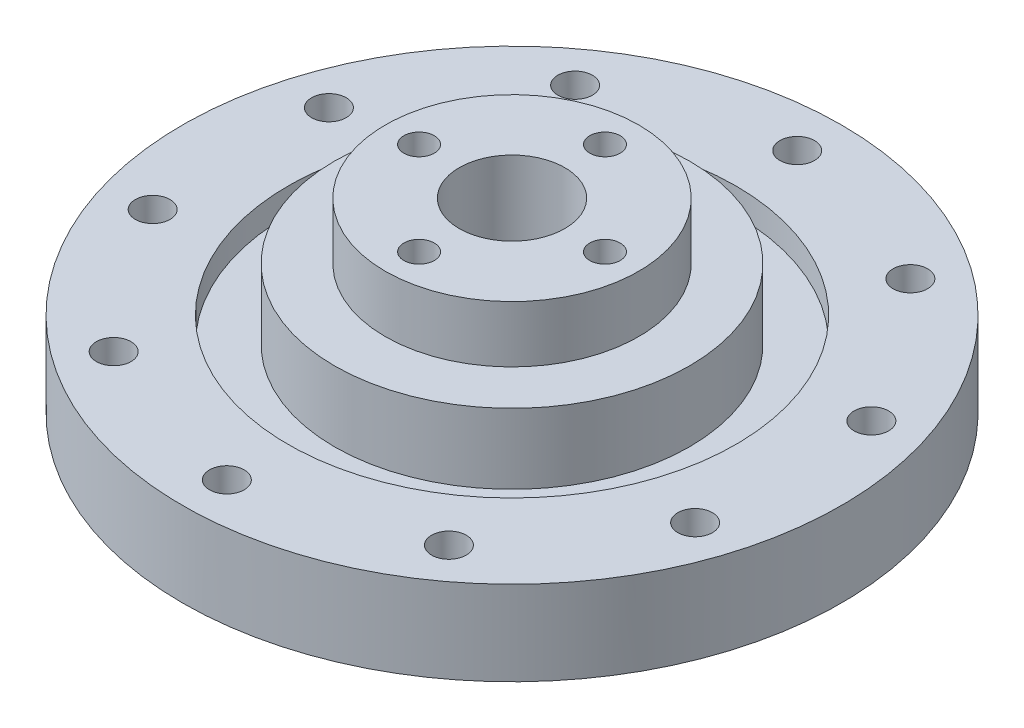
ISO-10303-21;
HEADER;
FILE_DESCRIPTION(('STEP AP214'),'2;1');
FILE_NAME('part.step','',(''),(''),'','','');
FILE_SCHEMA(('AUTOMOTIVE_DESIGN { 1 0 10303 214 1 1 1 1 }'));
ENDSEC;
DATA;
#1=APPLICATION_CONTEXT('core data for automotive mechanical design processes');
#2=APPLICATION_PROTOCOL_DEFINITION('international standard','automotive_design',2000,#1);
#3=PRODUCT_CONTEXT('',#1,'mechanical');
#4=PRODUCT('Part','Part','',(#3));
#5=PRODUCT_RELATED_PRODUCT_CATEGORY('part','',(#4));
#6=PRODUCT_DEFINITION_FORMATION('','',#4);
#7=PRODUCT_DEFINITION_CONTEXT('part definition',#1,'design');
#8=PRODUCT_DEFINITION('design','',#6,#7);
#9=PRODUCT_DEFINITION_SHAPE('','',#8);
#10=(LENGTH_UNIT() NAMED_UNIT(*) SI_UNIT(.MILLI.,.METRE.));
#11=(NAMED_UNIT(*) PLANE_ANGLE_UNIT() SI_UNIT($,.RADIAN.));
#12=(NAMED_UNIT(*) SI_UNIT($,.STERADIAN.) SOLID_ANGLE_UNIT());
#13=UNCERTAINTY_MEASURE_WITH_UNIT(LENGTH_MEASURE(1.E-05),#10,'distance_accuracy_value','');
#14=(GEOMETRIC_REPRESENTATION_CONTEXT(3) GLOBAL_UNCERTAINTY_ASSIGNED_CONTEXT((#13)) GLOBAL_UNIT_ASSIGNED_CONTEXT((#10,
#11,#12)) REPRESENTATION_CONTEXT('',''));
#15=CARTESIAN_POINT('',(0.,0.,0.));
#16=DIRECTION('',(0.,0.,1.));
#17=DIRECTION('',(1.,0.,0.));
#18=AXIS2_PLACEMENT_3D('',#15,#16,#17);
#19=CARTESIAN_POINT('',(0.,0.,0.));
#20=DIRECTION('',(0.,1.,0.));
#21=DIRECTION('',(0.,0.,1.));
#22=AXIS2_PLACEMENT_3D('',#19,#20,#21);
#23=PLANE('',#22);
#24=CARTESIAN_POINT('',(0.,0.,0.));
#25=DIRECTION('',(0.,1.,0.));
#26=DIRECTION('',(0.,0.,1.));
#27=AXIS2_PLACEMENT_3D('',#24,#25,#26);
#28=CIRCLE('',#27,39.);
#29=CARTESIAN_POINT('',(0.,0.,39.));
#30=VERTEX_POINT('',#29);
#31=EDGE_CURVE('E10',#30,#30,#28,.T.);
#32=ORIENTED_EDGE('',*,*,#31,.F.);
#33=EDGE_LOOP('',(#32));
#34=FACE_BOUND('',#33,.T.);
#35=CARTESIAN_POINT('',(19.8377522648712,0.,-27.3043235601553));
#36=DIRECTION('',(0.,1.,0.));
#37=DIRECTION('',(0.,0.,1.));
#38=AXIS2_PLACEMENT_3D('',#35,#36,#37);
#39=CIRCLE('',#38,2.05000000000006);
#40=CARTESIAN_POINT('',(19.8377522648712,0.,-25.2543235601553));
#41=VERTEX_POINT('',#40);
#42=EDGE_CURVE('E138',#41,#41,#39,.T.);
#43=ORIENTED_EDGE('',*,*,#42,.T.);
#44=EDGE_LOOP('',(#43));
#45=FACE_BOUND('',#44,.T.);
#46=CARTESIAN_POINT('',(32.0981574249624,0.,-10.4293235601558));
#47=DIRECTION('',(0.,1.,0.));
#48=DIRECTION('',(0.,0.,1.));
#49=AXIS2_PLACEMENT_3D('',#46,#47,#48);
#50=CIRCLE('',#49,2.05000000000065);
#51=CARTESIAN_POINT('',(32.0981574249624,0.,-8.37932356015519));
#52=VERTEX_POINT('',#51);
#53=EDGE_CURVE('E142',#52,#52,#50,.T.);
#54=ORIENTED_EDGE('',*,*,#53,.T.);
#55=EDGE_LOOP('',(#54));
#56=FACE_BOUND('',#55,.T.);
#57=CARTESIAN_POINT('',(32.0981574249633,0.,10.4293235601531));
#58=DIRECTION('',(0.,1.,0.));
#59=DIRECTION('',(0.,0.,1.));
#60=AXIS2_PLACEMENT_3D('',#57,#58,#59);
#61=CIRCLE('',#60,2.05000000000154);
#62=CARTESIAN_POINT('',(32.0981574249633,0.,12.4793235601547));
#63=VERTEX_POINT('',#62);
#64=EDGE_CURVE('E146',#63,#63,#61,.T.);
#65=ORIENTED_EDGE('',*,*,#64,.T.);
#66=EDGE_LOOP('',(#65));
#67=FACE_BOUND('',#66,.T.);
#68=CARTESIAN_POINT('',(19.8377522648736,0.,27.3043235601536));
#69=DIRECTION('',(0.,1.,0.));
#70=DIRECTION('',(0.,0.,1.));
#71=AXIS2_PLACEMENT_3D('',#68,#69,#70);
#72=CIRCLE('',#71,2.05000000000241);
#73=CARTESIAN_POINT('',(19.8377522648736,0.,29.354323560156));
#74=VERTEX_POINT('',#73);
#75=EDGE_CURVE('E150',#74,#74,#72,.T.);
#76=ORIENTED_EDGE('',*,*,#75,.T.);
#77=EDGE_LOOP('',(#76));
#78=FACE_BOUND('',#77,.T.);
#79=CARTESIAN_POINT('',(2.86529853098704E-12,0.,33.75));
#80=DIRECTION('',(0.,1.,0.));
#81=DIRECTION('',(0.,0.,1.));
#82=AXIS2_PLACEMENT_3D('',#79,#80,#81);
#83=CIRCLE('',#82,2.05000000000297);
#84=CARTESIAN_POINT('',(2.86529853098704E-12,0.,35.800000000003));
#85=VERTEX_POINT('',#84);
#86=EDGE_CURVE('E154',#85,#85,#83,.T.);
#87=ORIENTED_EDGE('',*,*,#86,.T.);
#88=EDGE_LOOP('',(#87));
#89=FACE_BOUND('',#88,.T.);
#90=CARTESIAN_POINT('',(-19.8377522648684,0.,27.3043235601553));
#91=DIRECTION('',(0.,1.,0.));
#92=DIRECTION('',(0.,0.,1.));
#93=AXIS2_PLACEMENT_3D('',#90,#91,#92);
#94=CIRCLE('',#93,2.050000000003);
#95=CARTESIAN_POINT('',(-19.8377522648684,0.,29.3543235601583));
#96=VERTEX_POINT('',#95);
#97=EDGE_CURVE('E158',#96,#96,#94,.T.);
#98=ORIENTED_EDGE('',*,*,#97,.T.);
#99=EDGE_LOOP('',(#98));
#100=FACE_BOUND('',#99,.T.);
#101=CARTESIAN_POINT('',(-32.0981574249596,0.,10.4293235601558));
#102=DIRECTION('',(0.,1.,0.));
#103=DIRECTION('',(0.,0.,1.));
#104=AXIS2_PLACEMENT_3D('',#101,#102,#103);
#105=CIRCLE('',#104,2.0500000000025);
#106=CARTESIAN_POINT('',(-32.0981574249596,0.,12.4793235601583));
#107=VERTEX_POINT('',#106);
#108=EDGE_CURVE('E162',#107,#107,#105,.T.);
#109=ORIENTED_EDGE('',*,*,#108,.T.);
#110=EDGE_LOOP('',(#109));
#111=FACE_BOUND('',#110,.T.);
#112=CARTESIAN_POINT('',(-32.0981574249604,0.,-10.4293235601531));
#113=DIRECTION('',(0.,1.,0.));
#114=DIRECTION('',(0.,0.,1.));
#115=AXIS2_PLACEMENT_3D('',#112,#113,#114);
#116=CIRCLE('',#115,2.05000000000172);
#117=CARTESIAN_POINT('',(-32.0981574249604,0.,-8.37932356015139));
#118=VERTEX_POINT('',#117);
#119=EDGE_CURVE('E166',#118,#118,#116,.T.);
#120=ORIENTED_EDGE('',*,*,#119,.T.);
#121=EDGE_LOOP('',(#120));
#122=FACE_BOUND('',#121,.T.);
#123=CARTESIAN_POINT('',(-19.8377522648707,0.,-27.3043235601536));
#124=DIRECTION('',(0.,1.,0.));
#125=DIRECTION('',(0.,0.,1.));
#126=AXIS2_PLACEMENT_3D('',#123,#124,#125);
#127=CIRCLE('',#126,2.05000000000094);
#128=CARTESIAN_POINT('',(-19.8377522648707,0.,-25.2543235601527));
#129=VERTEX_POINT('',#128);
#130=EDGE_CURVE('E170',#129,#129,#127,.T.);
#131=ORIENTED_EDGE('',*,*,#130,.T.);
#132=EDGE_LOOP('',(#131));
#133=FACE_BOUND('',#132,.T.);
#134=CARTESIAN_POINT('',(0.,0.,-33.75));
#135=DIRECTION('',(0.,1.,0.));
#136=DIRECTION('',(0.,0.,1.));
#137=AXIS2_PLACEMENT_3D('',#134,#135,#136);
#138=CIRCLE('',#137,2.05);
#139=CARTESIAN_POINT('',(0.,0.,-31.7));
#140=VERTEX_POINT('',#139);
#141=EDGE_CURVE('E174',#140,#140,#138,.T.);
#142=ORIENTED_EDGE('',*,*,#141,.T.);
#143=EDGE_LOOP('',(#142));
#144=FACE_BOUND('',#143,.T.);
#145=CARTESIAN_POINT('',(11.,0.,0.));
#146=DIRECTION('',(0.,-1.,0.));
#147=DIRECTION('',(0.,0.,-1.));
#148=AXIS2_PLACEMENT_3D('',#145,#146,#147);
#149=CIRCLE('',#148,4.55);
#150=CARTESIAN_POINT('',(11.,0.,-4.54999999999996));
#151=VERTEX_POINT('',#150);
#152=EDGE_CURVE('E178',#151,#151,#149,.T.);
#153=ORIENTED_EDGE('',*,*,#152,.F.);
#154=EDGE_LOOP('',(#153));
#155=FACE_BOUND('',#154,.T.);
#156=CARTESIAN_POINT('',(0.,0.,-11.));
#157=DIRECTION('',(0.,-1.,0.));
#158=DIRECTION('',(0.,0.,-1.));
#159=AXIS2_PLACEMENT_3D('',#156,#157,#158);
#160=CIRCLE('',#159,4.55);
#161=CARTESIAN_POINT('',(0.,0.,-15.55));
#162=VERTEX_POINT('',#161);
#163=EDGE_CURVE('E84',#162,#162,#160,.T.);
#164=ORIENTED_EDGE('',*,*,#163,.F.);
#165=EDGE_LOOP('',(#164));
#166=FACE_BOUND('',#165,.T.);
#167=CARTESIAN_POINT('',(-10.9999999999998,0.,1.55645846127691E-13));
#168=DIRECTION('',(0.,-1.,0.));
#169=DIRECTION('',(0.,0.,-1.));
#170=AXIS2_PLACEMENT_3D('',#167,#168,#169);
#171=CIRCLE('',#170,4.55);
#172=CARTESIAN_POINT('',(-10.9999999999998,0.,-4.54999999999985));
#173=VERTEX_POINT('',#172);
#174=EDGE_CURVE('E70',#173,#173,#171,.T.);
#175=ORIENTED_EDGE('',*,*,#174,.F.);
#176=EDGE_LOOP('',(#175));
#177=FACE_BOUND('',#176,.T.);
#178=CARTESIAN_POINT('',(0.,0.,0.));
#179=DIRECTION('',(0.,1.,0.));
#180=DIRECTION('',(0.,0.,1.));
#181=AXIS2_PLACEMENT_3D('',#178,#179,#180);
#182=CIRCLE('',#181,6.25);
#183=CARTESIAN_POINT('',(0.,0.,6.25));
#184=VERTEX_POINT('',#183);
#185=EDGE_CURVE('E58',#184,#184,#182,.T.);
#186=ORIENTED_EDGE('',*,*,#185,.T.);
#187=EDGE_LOOP('',(#186));
#188=FACE_BOUND('',#187,.T.);
#189=CARTESIAN_POINT('',(3.08597469297258E-13,0.,11.));
#190=DIRECTION('',(0.,-1.,0.));
#191=DIRECTION('',(0.,0.,-1.));
#192=AXIS2_PLACEMENT_3D('',#189,#190,#191);
#193=CIRCLE('',#192,4.55);
#194=CARTESIAN_POINT('',(3.08597469297258E-13,0.,6.45));
#195=VERTEX_POINT('',#194);
#196=EDGE_CURVE('E66',#195,#195,#193,.T.);
#197=ORIENTED_EDGE('',*,*,#196,.F.);
#198=EDGE_LOOP('',(#197));
#199=FACE_BOUND('',#198,.T.);
#200=ADVANCED_FACE('F43',(#34,#45,#56,#67,#78,#89,#100,#111,#122,#133,#144,#155,#166,#177,#188,
#199),#23,.F.);
#201=CARTESIAN_POINT('',(0.,7.,0.));
#202=DIRECTION('',(0.,-1.,0.));
#203=DIRECTION('',(0.,0.,-1.));
#204=AXIS2_PLACEMENT_3D('',#201,#202,#203);
#205=CYLINDRICAL_SURFACE('',#204,39.);
#206=ORIENTED_EDGE('',*,*,#31,.T.);
#207=EDGE_LOOP('',(#206));
#208=FACE_BOUND('',#207,.T.);
#209=CARTESIAN_POINT('',(0.,10.,0.));
#210=DIRECTION('',(0.,-1.,0.));
#211=DIRECTION('',(0.,0.,-1.));
#212=AXIS2_PLACEMENT_3D('',#209,#210,#211);
#213=CIRCLE('',#212,39.);
#214=CARTESIAN_POINT('',(0.,10.,-39.));
#215=VERTEX_POINT('',#214);
#216=EDGE_CURVE('E252',#215,#215,#213,.T.);
#217=ORIENTED_EDGE('',*,*,#216,.T.);
#218=EDGE_LOOP('',(#217));
#219=FACE_BOUND('',#218,.T.);
#220=ADVANCED_FACE('F45',(#208,#219),#205,.T.);
#221=CARTESIAN_POINT('',(0.,22.,0.));
#222=DIRECTION('',(0.,-1.,0.));
#223=DIRECTION('',(0.,0.,-1.));
#224=AXIS2_PLACEMENT_3D('',#221,#222,#223);
#225=CYLINDRICAL_SURFACE('',#224,15.);
#226=CARTESIAN_POINT('',(0.,15.3,0.));
#227=DIRECTION('',(0.,1.,0.));
#228=DIRECTION('',(0.,0.,1.));
#229=AXIS2_PLACEMENT_3D('',#226,#227,#228);
#230=CIRCLE('',#229,15.);
#231=CARTESIAN_POINT('',(0.,15.3,15.));
#232=VERTEX_POINT('',#231);
#233=EDGE_CURVE('E301',#232,#232,#230,.T.);
#234=ORIENTED_EDGE('',*,*,#233,.T.);
#235=EDGE_LOOP('',(#234));
#236=FACE_BOUND('',#235,.T.);
#237=CARTESIAN_POINT('',(0.,22.,0.));
#238=DIRECTION('',(0.,1.,0.));
#239=DIRECTION('',(0.,0.,1.));
#240=AXIS2_PLACEMENT_3D('',#237,#238,#239);
#241=CIRCLE('',#240,15.);
#242=CARTESIAN_POINT('',(0.,22.,15.));
#243=VERTEX_POINT('',#242);
#244=EDGE_CURVE('E52',#243,#243,#241,.T.);
#245=ORIENTED_EDGE('',*,*,#244,.F.);
#246=EDGE_LOOP('',(#245));
#247=FACE_BOUND('',#246,.T.);
#248=ADVANCED_FACE('F115',(#236,#247),#225,.T.);
#249=CARTESIAN_POINT('',(0.,22.,0.));
#250=DIRECTION('',(0.,1.,0.));
#251=DIRECTION('',(0.,0.,1.));
#252=AXIS2_PLACEMENT_3D('',#249,#250,#251);
#253=PLANE('',#252);
#254=CARTESIAN_POINT('',(0.,22.,-11.));
#255=DIRECTION('',(0.,1.,0.));
#256=DIRECTION('',(0.,0.,1.));
#257=AXIS2_PLACEMENT_3D('',#254,#255,#256);
#258=CIRCLE('',#257,1.8);
#259=CARTESIAN_POINT('',(0.,22.,-9.2));
#260=VERTEX_POINT('',#259);
#261=EDGE_CURVE('E96',#260,#260,#258,.T.);
#262=ORIENTED_EDGE('',*,*,#261,.F.);
#263=EDGE_LOOP('',(#262));
#264=FACE_BOUND('',#263,.T.);
#265=CARTESIAN_POINT('',(11.,22.,0.));
#266=DIRECTION('',(0.,1.,0.));
#267=DIRECTION('',(0.,0.,1.));
#268=AXIS2_PLACEMENT_3D('',#265,#266,#267);
#269=CIRCLE('',#268,1.8);
#270=CARTESIAN_POINT('',(11.,22.,1.80000000000004));
#271=VERTEX_POINT('',#270);
#272=EDGE_CURVE('E92',#271,#271,#269,.T.);
#273=ORIENTED_EDGE('',*,*,#272,.F.);
#274=EDGE_LOOP('',(#273));
#275=FACE_BOUND('',#274,.T.);
#276=CARTESIAN_POINT('',(3.08597469297258E-13,22.,11.));
#277=DIRECTION('',(0.,1.,0.));
#278=DIRECTION('',(0.,0.,1.));
#279=AXIS2_PLACEMENT_3D('',#276,#277,#278);
#280=CIRCLE('',#279,1.8);
#281=CARTESIAN_POINT('',(3.08597469297258E-13,22.,12.8));
#282=VERTEX_POINT('',#281);
#283=EDGE_CURVE('E88',#282,#282,#280,.T.);
#284=ORIENTED_EDGE('',*,*,#283,.F.);
#285=EDGE_LOOP('',(#284));
#286=FACE_BOUND('',#285,.T.);
#287=CARTESIAN_POINT('',(-10.9999999999998,22.,1.55645846127691E-13));
#288=DIRECTION('',(0.,1.,0.));
#289=DIRECTION('',(0.,0.,1.));
#290=AXIS2_PLACEMENT_3D('',#287,#288,#289);
#291=CIRCLE('',#290,1.8);
#292=CARTESIAN_POINT('',(-10.9999999999998,22.,1.80000000000015));
#293=VERTEX_POINT('',#292);
#294=EDGE_CURVE('E65',#293,#293,#291,.T.);
#295=ORIENTED_EDGE('',*,*,#294,.F.);
#296=EDGE_LOOP('',(#295));
#297=FACE_BOUND('',#296,.T.);
#298=CARTESIAN_POINT('',(0.,22.,0.));
#299=DIRECTION('',(0.,1.,0.));
#300=DIRECTION('',(0.,0.,1.));
#301=AXIS2_PLACEMENT_3D('',#298,#299,#300);
#302=CIRCLE('',#301,6.25);
#303=CARTESIAN_POINT('',(0.,22.,6.25));
#304=VERTEX_POINT('',#303);
#305=EDGE_CURVE('E100',#304,#304,#302,.T.);
#306=ORIENTED_EDGE('',*,*,#305,.F.);
#307=EDGE_LOOP('',(#306));
#308=FACE_BOUND('',#307,.T.);
#309=ORIENTED_EDGE('',*,*,#244,.T.);
#310=EDGE_LOOP('',(#309));
#311=FACE_BOUND('',#310,.T.);
#312=ADVANCED_FACE('F112',(#264,#275,#286,#297,#308,#311),#253,.T.);
#313=CARTESIAN_POINT('',(0.,0.,0.));
#314=DIRECTION('',(0.,1.,0.));
#315=DIRECTION('',(0.,0.,1.));
#316=AXIS2_PLACEMENT_3D('',#313,#314,#315);
#317=CYLINDRICAL_SURFACE('',#316,6.25);
#318=ORIENTED_EDGE('',*,*,#185,.F.);
#319=EDGE_LOOP('',(#318));
#320=FACE_BOUND('',#319,.T.);
#321=ORIENTED_EDGE('',*,*,#305,.T.);
#322=EDGE_LOOP('',(#321));
#323=FACE_BOUND('',#322,.T.);
#324=ADVANCED_FACE('F110',(#320,#323),#317,.F.);
#325=CARTESIAN_POINT('',(-10.9999999999998,0.,1.55645846127691E-13));
#326=DIRECTION('',(0.,1.,0.));
#327=DIRECTION('',(0.,0.,1.));
#328=AXIS2_PLACEMENT_3D('',#325,#326,#327);
#329=CYLINDRICAL_SURFACE('',#328,1.8);
#330=CARTESIAN_POINT('',(-10.9999999999998,2.74999999999999,1.55645846127691E-13));
#331=DIRECTION('',(0.,-1.,0.));
#332=DIRECTION('',(0.,0.,-1.));
#333=AXIS2_PLACEMENT_3D('',#330,#331,#332);
#334=CIRCLE('',#333,1.8);
#335=CARTESIAN_POINT('',(-10.9999999999998,2.74999999999999,-1.79999999999984));
#336=VERTEX_POINT('',#335);
#337=EDGE_CURVE('E67',#336,#336,#334,.T.);
#338=ORIENTED_EDGE('',*,*,#337,.T.);
#339=EDGE_LOOP('',(#338));
#340=FACE_BOUND('',#339,.T.);
#341=ORIENTED_EDGE('',*,*,#294,.T.);
#342=EDGE_LOOP('',(#341));
#343=FACE_BOUND('',#342,.T.);
#344=ADVANCED_FACE('F199',(#340,#343),#329,.F.);
#345=CARTESIAN_POINT('',(3.08597469297258E-13,0.,11.));
#346=DIRECTION('',(0.,1.,0.));
#347=DIRECTION('',(0.,0.,1.));
#348=AXIS2_PLACEMENT_3D('',#345,#346,#347);
#349=CYLINDRICAL_SURFACE('',#348,1.8);
#350=CARTESIAN_POINT('',(3.08597469297258E-13,2.74999999999998,11.));
#351=DIRECTION('',(0.,-1.,0.));
#352=DIRECTION('',(0.,0.,-1.));
#353=AXIS2_PLACEMENT_3D('',#350,#351,#352);
#354=CIRCLE('',#353,1.8);
#355=CARTESIAN_POINT('',(3.08597469297258E-13,2.74999999999998,9.2));
#356=VERTEX_POINT('',#355);
#357=EDGE_CURVE('E62',#356,#356,#354,.T.);
#358=ORIENTED_EDGE('',*,*,#357,.T.);
#359=EDGE_LOOP('',(#358));
#360=FACE_BOUND('',#359,.T.);
#361=ORIENTED_EDGE('',*,*,#283,.T.);
#362=EDGE_LOOP('',(#361));
#363=FACE_BOUND('',#362,.T.);
#364=ADVANCED_FACE('F195',(#360,#363),#349,.F.);
#365=CARTESIAN_POINT('',(11.,0.,0.));
#366=DIRECTION('',(0.,1.,0.));
#367=DIRECTION('',(0.,0.,1.));
#368=AXIS2_PLACEMENT_3D('',#365,#366,#367);
#369=CYLINDRICAL_SURFACE('',#368,1.8);
#370=CARTESIAN_POINT('',(11.,2.74999999999999,0.));
#371=DIRECTION('',(0.,-1.,0.));
#372=DIRECTION('',(0.,0.,-1.));
#373=AXIS2_PLACEMENT_3D('',#370,#371,#372);
#374=CIRCLE('',#373,1.8);
#375=CARTESIAN_POINT('',(11.,2.74999999999999,-1.79999999999996));
#376=VERTEX_POINT('',#375);
#377=EDGE_CURVE('E47',#376,#376,#374,.T.);
#378=ORIENTED_EDGE('',*,*,#377,.T.);
#379=EDGE_LOOP('',(#378));
#380=FACE_BOUND('',#379,.T.);
#381=ORIENTED_EDGE('',*,*,#272,.T.);
#382=EDGE_LOOP('',(#381));
#383=FACE_BOUND('',#382,.T.);
#384=ADVANCED_FACE('F198',(#380,#383),#369,.F.);
#385=CARTESIAN_POINT('',(0.,0.,-11.));
#386=DIRECTION('',(0.,1.,0.));
#387=DIRECTION('',(0.,0.,1.));
#388=AXIS2_PLACEMENT_3D('',#385,#386,#387);
#389=CYLINDRICAL_SURFACE('',#388,1.8);
#390=CARTESIAN_POINT('',(0.,2.74999999999998,-11.));
#391=DIRECTION('',(0.,-1.,0.));
#392=DIRECTION('',(0.,0.,-1.));
#393=AXIS2_PLACEMENT_3D('',#390,#391,#392);
#394=CIRCLE('',#393,1.8);
#395=CARTESIAN_POINT('',(0.,2.74999999999998,-12.8));
#396=VERTEX_POINT('',#395);
#397=EDGE_CURVE('E78',#396,#396,#394,.T.);
#398=ORIENTED_EDGE('',*,*,#397,.T.);
#399=EDGE_LOOP('',(#398));
#400=FACE_BOUND('',#399,.T.);
#401=ORIENTED_EDGE('',*,*,#261,.T.);
#402=EDGE_LOOP('',(#401));
#403=FACE_BOUND('',#402,.T.);
#404=ADVANCED_FACE('F191',(#400,#403),#389,.F.);
#405=CARTESIAN_POINT('',(3.08597469297258E-13,0.,11.));
#406=DIRECTION('',(0.,-1.,0.));
#407=DIRECTION('',(0.,0.,-1.));
#408=AXIS2_PLACEMENT_3D('',#405,#406,#407);
#409=CONICAL_SURFACE('',#408,4.55,0.785398163397451);
#410=ORIENTED_EDGE('',*,*,#196,.T.);
#411=EDGE_LOOP('',(#410));
#412=FACE_BOUND('',#411,.T.);
#413=ORIENTED_EDGE('',*,*,#357,.F.);
#414=EDGE_LOOP('',(#413));
#415=FACE_BOUND('',#414,.T.);
#416=ADVANCED_FACE('F187',(#412,#415),#409,.F.);
#417=CARTESIAN_POINT('',(-10.9999999999998,0.,1.55645846127691E-13));
#418=DIRECTION('',(0.,-1.,0.));
#419=DIRECTION('',(0.,0.,-1.));
#420=AXIS2_PLACEMENT_3D('',#417,#418,#419);
#421=CONICAL_SURFACE('',#420,4.55,0.785398163397451);
#422=ORIENTED_EDGE('',*,*,#174,.T.);
#423=EDGE_LOOP('',(#422));
#424=FACE_BOUND('',#423,.T.);
#425=ORIENTED_EDGE('',*,*,#337,.F.);
#426=EDGE_LOOP('',(#425));
#427=FACE_BOUND('',#426,.T.);
#428=ADVANCED_FACE('F190',(#424,#427),#421,.F.);
#429=CARTESIAN_POINT('',(0.,0.,-11.));
#430=DIRECTION('',(0.,-1.,0.));
#431=DIRECTION('',(0.,0.,-1.));
#432=AXIS2_PLACEMENT_3D('',#429,#430,#431);
#433=CONICAL_SURFACE('',#432,4.55,0.785398163397451);
#434=ORIENTED_EDGE('',*,*,#163,.T.);
#435=EDGE_LOOP('',(#434));
#436=FACE_BOUND('',#435,.T.);
#437=ORIENTED_EDGE('',*,*,#397,.F.);
#438=EDGE_LOOP('',(#437));
#439=FACE_BOUND('',#438,.T.);
#440=ADVANCED_FACE('F376',(#436,#439),#433,.F.);
#441=CARTESIAN_POINT('',(11.,0.,0.));
#442=DIRECTION('',(0.,-1.,0.));
#443=DIRECTION('',(0.,0.,-1.));
#444=AXIS2_PLACEMENT_3D('',#441,#442,#443);
#445=CONICAL_SURFACE('',#444,4.55,0.785398163397451);
#446=ORIENTED_EDGE('',*,*,#152,.T.);
#447=EDGE_LOOP('',(#446));
#448=FACE_BOUND('',#447,.T.);
#449=ORIENTED_EDGE('',*,*,#377,.F.);
#450=EDGE_LOOP('',(#449));
#451=FACE_BOUND('',#450,.T.);
#452=ADVANCED_FACE('F347',(#448,#451),#445,.F.);
#453=CARTESIAN_POINT('',(19.8377522648712,0.,-27.3043235601553));
#454=DIRECTION('',(0.,1.,0.));
#455=DIRECTION('',(0.,0.,1.));
#456=AXIS2_PLACEMENT_3D('',#453,#454,#455);
#457=CYLINDRICAL_SURFACE('',#456,2.05000000000006);
#458=ORIENTED_EDGE('',*,*,#42,.F.);
#459=EDGE_LOOP('',(#458));
#460=FACE_BOUND('',#459,.T.);
#461=CARTESIAN_POINT('',(19.8377522648685,10.,-27.3043235601563));
#462=DIRECTION('',(0.,-1.,0.));
#463=DIRECTION('',(0.,0.,-1.));
#464=AXIS2_PLACEMENT_3D('',#461,#462,#463);
#465=CIRCLE('',#464,2.05000000000297);
#466=CARTESIAN_POINT('',(19.8377522648685,10.,-29.3543235601592));
#467=VERTEX_POINT('',#466);
#468=EDGE_CURVE('E273',#467,#467,#465,.T.);
#469=ORIENTED_EDGE('',*,*,#468,.F.);
#470=EDGE_LOOP('',(#469));
#471=FACE_BOUND('',#470,.T.);
#472=ADVANCED_FACE('F343',(#460,#471),#457,.F.);
#473=CARTESIAN_POINT('',(32.0981574249624,0.,-10.4293235601558));
#474=DIRECTION('',(0.,1.,0.));
#475=DIRECTION('',(0.,0.,1.));
#476=AXIS2_PLACEMENT_3D('',#473,#474,#475);
#477=CYLINDRICAL_SURFACE('',#476,2.05000000000065);
#478=ORIENTED_EDGE('',*,*,#53,.F.);
#479=EDGE_LOOP('',(#478));
#480=FACE_BOUND('',#479,.T.);
#481=CARTESIAN_POINT('',(32.0981574249605,10.,-10.4293235601573));
#482=DIRECTION('',(0.,-1.,0.));
#483=DIRECTION('',(0.,0.,-1.));
#484=AXIS2_PLACEMENT_3D('',#481,#482,#483);
#485=CIRCLE('',#484,2.05000000000297);
#486=CARTESIAN_POINT('',(32.0981574249605,10.,-12.4793235601603));
#487=VERTEX_POINT('',#486);
#488=EDGE_CURVE('E269',#487,#487,#485,.T.);
#489=ORIENTED_EDGE('',*,*,#488,.F.);
#490=EDGE_LOOP('',(#489));
#491=FACE_BOUND('',#490,.T.);
#492=ADVANCED_FACE('F346',(#480,#491),#477,.F.);
#493=CARTESIAN_POINT('',(32.0981574249633,0.,10.4293235601531));
#494=DIRECTION('',(0.,1.,0.));
#495=DIRECTION('',(0.,0.,1.));
#496=AXIS2_PLACEMENT_3D('',#493,#494,#495);
#497=CYLINDRICAL_SURFACE('',#496,2.05000000000154);
#498=ORIENTED_EDGE('',*,*,#64,.F.);
#499=EDGE_LOOP('',(#498));
#500=FACE_BOUND('',#499,.T.);
#501=CARTESIAN_POINT('',(32.0981574249624,10.,10.4293235601517));
#502=DIRECTION('',(0.,-1.,0.));
#503=DIRECTION('',(0.,0.,-1.));
#504=AXIS2_PLACEMENT_3D('',#501,#502,#503);
#505=CIRCLE('',#504,2.05000000000297);
#506=CARTESIAN_POINT('',(32.0981574249624,10.,8.3793235601487));
#507=VERTEX_POINT('',#506);
#508=EDGE_CURVE('E265',#507,#507,#505,.T.);
#509=ORIENTED_EDGE('',*,*,#508,.F.);
#510=EDGE_LOOP('',(#509));
#511=FACE_BOUND('',#510,.T.);
#512=ADVANCED_FACE('F351',(#500,#511),#497,.F.);
#513=CARTESIAN_POINT('',(19.8377522648736,0.,27.3043235601536));
#514=DIRECTION('',(0.,1.,0.));
#515=DIRECTION('',(0.,0.,1.));
#516=AXIS2_PLACEMENT_3D('',#513,#514,#515);
#517=CYLINDRICAL_SURFACE('',#516,2.05000000000241);
#518=ORIENTED_EDGE('',*,*,#75,.F.);
#519=EDGE_LOOP('',(#518));
#520=FACE_BOUND('',#519,.T.);
#521=CARTESIAN_POINT('',(19.8377522648733,10.,27.3043235601528));
#522=DIRECTION('',(0.,-1.,0.));
#523=DIRECTION('',(0.,0.,-1.));
#524=AXIS2_PLACEMENT_3D('',#521,#522,#523);
#525=CIRCLE('',#524,2.05000000000297);
#526=CARTESIAN_POINT('',(19.8377522648733,10.,25.2543235601498));
#527=VERTEX_POINT('',#526);
#528=EDGE_CURVE('E261',#527,#527,#525,.T.);
#529=ORIENTED_EDGE('',*,*,#528,.F.);
#530=EDGE_LOOP('',(#529));
#531=FACE_BOUND('',#530,.T.);
#532=ADVANCED_FACE('F355',(#520,#531),#517,.F.);
#533=CARTESIAN_POINT('',(2.86529853098704E-12,0.,33.75));
#534=DIRECTION('',(0.,1.,0.));
#535=DIRECTION('',(0.,0.,1.));
#536=AXIS2_PLACEMENT_3D('',#533,#534,#535);
#537=CYLINDRICAL_SURFACE('',#536,2.05000000000297);
#538=ORIENTED_EDGE('',*,*,#86,.F.);
#539=EDGE_LOOP('',(#538));
#540=FACE_BOUND('',#539,.T.);
#541=CARTESIAN_POINT('',(2.86529853098704E-12,10.,33.75));
#542=DIRECTION('',(0.,-1.,0.));
#543=DIRECTION('',(0.,0.,-1.));
#544=AXIS2_PLACEMENT_3D('',#541,#542,#543);
#545=CIRCLE('',#544,2.05000000000297);
#546=CARTESIAN_POINT('',(2.86529853098704E-12,10.,31.699999999997));
#547=VERTEX_POINT('',#546);
#548=EDGE_CURVE('E257',#547,#547,#545,.T.);
#549=ORIENTED_EDGE('',*,*,#548,.F.);
#550=EDGE_LOOP('',(#549));
#551=FACE_BOUND('',#550,.T.);
#552=ADVANCED_FACE('F359',(#540,#551),#537,.F.);
#553=CARTESIAN_POINT('',(-19.8377522648684,0.,27.3043235601553));
#554=DIRECTION('',(0.,1.,0.));
#555=DIRECTION('',(0.,0.,1.));
#556=AXIS2_PLACEMENT_3D('',#553,#554,#555);
#557=CYLINDRICAL_SURFACE('',#556,2.050000000003);
#558=ORIENTED_EDGE('',*,*,#97,.F.);
#559=EDGE_LOOP('',(#558));
#560=FACE_BOUND('',#559,.T.);
#561=CARTESIAN_POINT('',(-19.8377522648683,10.,27.3043235601564));
#562=DIRECTION('',(0.,-1.,0.));
#563=DIRECTION('',(0.,0.,-1.));
#564=AXIS2_PLACEMENT_3D('',#561,#562,#563);
#565=CIRCLE('',#564,2.05000000000296);
#566=CARTESIAN_POINT('',(-19.8377522648683,10.,25.2543235601535));
#567=VERTEX_POINT('',#566);
#568=EDGE_CURVE('E293',#567,#567,#565,.T.);
#569=ORIENTED_EDGE('',*,*,#568,.F.);
#570=EDGE_LOOP('',(#569));
#571=FACE_BOUND('',#570,.T.);
#572=ADVANCED_FACE('F363',(#560,#571),#557,.F.);
#573=CARTESIAN_POINT('',(-32.0981574249596,0.,10.4293235601558));
#574=DIRECTION('',(0.,1.,0.));
#575=DIRECTION('',(0.,0.,1.));
#576=AXIS2_PLACEMENT_3D('',#573,#574,#575);
#577=CYLINDRICAL_SURFACE('',#576,2.0500000000025);
#578=ORIENTED_EDGE('',*,*,#108,.F.);
#579=EDGE_LOOP('',(#578));
#580=FACE_BOUND('',#579,.T.);
#581=CARTESIAN_POINT('',(-32.0981574249604,10.,10.4293235601576));
#582=DIRECTION('',(0.,-1.,0.));
#583=DIRECTION('',(0.,0.,-1.));
#584=AXIS2_PLACEMENT_3D('',#581,#582,#583);
#585=CIRCLE('',#584,2.05000000000297);
#586=CARTESIAN_POINT('',(-32.0981574249604,10.,8.37932356015459));
#587=VERTEX_POINT('',#586);
#588=EDGE_CURVE('E289',#587,#587,#585,.T.);
#589=ORIENTED_EDGE('',*,*,#588,.F.);
#590=EDGE_LOOP('',(#589));
#591=FACE_BOUND('',#590,.T.);
#592=ADVANCED_FACE('F367',(#580,#591),#577,.F.);
#593=CARTESIAN_POINT('',(-32.0981574249604,0.,-10.4293235601531));
#594=DIRECTION('',(0.,1.,0.));
#595=DIRECTION('',(0.,0.,1.));
#596=AXIS2_PLACEMENT_3D('',#593,#594,#595);
#597=CYLINDRICAL_SURFACE('',#596,2.05000000000172);
#598=ORIENTED_EDGE('',*,*,#119,.F.);
#599=EDGE_LOOP('',(#598));
#600=FACE_BOUND('',#599,.T.);
#601=CARTESIAN_POINT('',(-32.0981574249624,10.,-10.4293235601514));
#602=DIRECTION('',(0.,-1.,0.));
#603=DIRECTION('',(0.,0.,-1.));
#604=AXIS2_PLACEMENT_3D('',#601,#602,#603);
#605=CIRCLE('',#604,2.05000000000297);
#606=CARTESIAN_POINT('',(-32.0981574249624,10.,-12.4793235601544));
#607=VERTEX_POINT('',#606);
#608=EDGE_CURVE('E285',#607,#607,#605,.T.);
#609=ORIENTED_EDGE('',*,*,#608,.F.);
#610=EDGE_LOOP('',(#609));
#611=FACE_BOUND('',#610,.T.);
#612=ADVANCED_FACE('F341',(#600,#611),#597,.F.);
#613=CARTESIAN_POINT('',(-19.8377522648707,0.,-27.3043235601536));
#614=DIRECTION('',(0.,1.,0.));
#615=DIRECTION('',(0.,0.,1.));
#616=AXIS2_PLACEMENT_3D('',#613,#614,#615);
#617=CYLINDRICAL_SURFACE('',#616,2.05000000000094);
#618=ORIENTED_EDGE('',*,*,#130,.F.);
#619=EDGE_LOOP('',(#618));
#620=FACE_BOUND('',#619,.T.);
#621=CARTESIAN_POINT('',(-19.8377522648735,10.,-27.3043235601526));
#622=DIRECTION('',(0.,-1.,0.));
#623=DIRECTION('',(0.,0.,-1.));
#624=AXIS2_PLACEMENT_3D('',#621,#622,#623);
#625=CIRCLE('',#624,2.05000000000297);
#626=CARTESIAN_POINT('',(-19.8377522648735,10.,-29.3543235601556));
#627=VERTEX_POINT('',#626);
#628=EDGE_CURVE('E281',#627,#627,#625,.T.);
#629=ORIENTED_EDGE('',*,*,#628,.F.);
#630=EDGE_LOOP('',(#629));
#631=FACE_BOUND('',#630,.T.);
#632=ADVANCED_FACE('F331',(#620,#631),#617,.F.);
#633=CARTESIAN_POINT('',(0.,0.,-33.75));
#634=DIRECTION('',(0.,1.,0.));
#635=DIRECTION('',(0.,0.,1.));
#636=AXIS2_PLACEMENT_3D('',#633,#634,#635);
#637=CYLINDRICAL_SURFACE('',#636,2.05);
#638=ORIENTED_EDGE('',*,*,#141,.F.);
#639=EDGE_LOOP('',(#638));
#640=FACE_BOUND('',#639,.T.);
#641=CARTESIAN_POINT('',(-3.10097352135895E-12,10.,-33.75));
#642=DIRECTION('',(0.,-1.,0.));
#643=DIRECTION('',(0.,0.,-1.));
#644=AXIS2_PLACEMENT_3D('',#641,#642,#643);
#645=CIRCLE('',#644,2.05000000000297);
#646=CARTESIAN_POINT('',(-3.10097352135895E-12,10.,-35.800000000003));
#647=VERTEX_POINT('',#646);
#648=EDGE_CURVE('E277',#647,#647,#645,.T.);
#649=ORIENTED_EDGE('',*,*,#648,.F.);
#650=EDGE_LOOP('',(#649));
#651=FACE_BOUND('',#650,.T.);
#652=ADVANCED_FACE('F322',(#640,#651),#637,.F.);
#653=CARTESIAN_POINT('',(0.,10.,0.));
#654=DIRECTION('',(0.,-1.,0.));
#655=DIRECTION('',(0.,0.,-1.));
#656=AXIS2_PLACEMENT_3D('',#653,#654,#655);
#657=PLANE('',#656);
#658=ORIENTED_EDGE('',*,*,#216,.F.);
#659=EDGE_LOOP('',(#658));
#660=FACE_BOUND('',#659,.T.);
#661=ORIENTED_EDGE('',*,*,#568,.T.);
#662=EDGE_LOOP('',(#661));
#663=FACE_BOUND('',#662,.T.);
#664=ORIENTED_EDGE('',*,*,#588,.T.);
#665=EDGE_LOOP('',(#664));
#666=FACE_BOUND('',#665,.T.);
#667=ORIENTED_EDGE('',*,*,#608,.T.);
#668=EDGE_LOOP('',(#667));
#669=FACE_BOUND('',#668,.T.);
#670=ORIENTED_EDGE('',*,*,#628,.T.);
#671=EDGE_LOOP('',(#670));
#672=FACE_BOUND('',#671,.T.);
#673=ORIENTED_EDGE('',*,*,#648,.T.);
#674=EDGE_LOOP('',(#673));
#675=FACE_BOUND('',#674,.T.);
#676=ORIENTED_EDGE('',*,*,#468,.T.);
#677=EDGE_LOOP('',(#676));
#678=FACE_BOUND('',#677,.T.);
#679=ORIENTED_EDGE('',*,*,#488,.T.);
#680=EDGE_LOOP('',(#679));
#681=FACE_BOUND('',#680,.T.);
#682=ORIENTED_EDGE('',*,*,#508,.T.);
#683=EDGE_LOOP('',(#682));
#684=FACE_BOUND('',#683,.T.);
#685=ORIENTED_EDGE('',*,*,#528,.T.);
#686=EDGE_LOOP('',(#685));
#687=FACE_BOUND('',#686,.T.);
#688=ORIENTED_EDGE('',*,*,#548,.T.);
#689=EDGE_LOOP('',(#688));
#690=FACE_BOUND('',#689,.T.);
#691=CARTESIAN_POINT('',(0.,9.99999999999999,0.));
#692=DIRECTION('',(0.,-1.,0.));
#693=DIRECTION('',(0.,0.,-1.));
#694=AXIS2_PLACEMENT_3D('',#691,#692,#693);
#695=CIRCLE('',#694,26.5);
#696=CARTESIAN_POINT('',(0.,9.99999999999999,-26.5));
#697=VERTEX_POINT('',#696);
#698=EDGE_CURVE('E312',#697,#697,#695,.F.);
#699=ORIENTED_EDGE('',*,*,#698,.F.);
#700=EDGE_LOOP('',(#699));
#701=FACE_BOUND('',#700,.T.);
#702=ADVANCED_FACE('F320',(#660,#663,#666,#669,#672,#675,#678,#681,#684,#687,#690,#701),#657,.F.);
#703=CARTESIAN_POINT('',(0.,17.5,0.));
#704=DIRECTION('',(0.,-1.,0.));
#705=DIRECTION('',(0.,0.,-1.));
#706=AXIS2_PLACEMENT_3D('',#703,#704,#705);
#707=CYLINDRICAL_SURFACE('',#706,26.5);
#708=CARTESIAN_POINT('',(0.,7.,0.));
#709=DIRECTION('',(0.,1.,0.));
#710=DIRECTION('',(0.,0.,1.));
#711=AXIS2_PLACEMENT_3D('',#708,#709,#710);
#712=CIRCLE('',#711,26.5);
#713=CARTESIAN_POINT('',(0.,7.,-26.5));
#714=VERTEX_POINT('',#713);
#715=EDGE_CURVE('E304',#714,#714,#712,.T.);
#716=CARTESIAN_POINT('',(0.,9.99999999999999,-26.5));
#717=CARTESIAN_POINT('',(0.,9.96874999999999,-26.5));
#718=CARTESIAN_POINT('',(0.,9.93749999999999,-26.5));
#719=CARTESIAN_POINT('',(0.,9.87499999999999,-26.5));
#720=CARTESIAN_POINT('',(0.,9.84374999999999,-26.5));
#721=CARTESIAN_POINT('',(0.,9.78124999999999,-26.5));
#722=CARTESIAN_POINT('',(0.,9.75,-26.5));
#723=CARTESIAN_POINT('',(0.,9.6875,-26.5));
#724=CARTESIAN_POINT('',(0.,9.65625,-26.5));
#725=CARTESIAN_POINT('',(0.,9.59375,-26.5));
#726=CARTESIAN_POINT('',(0.,9.5625,-26.5));
#727=CARTESIAN_POINT('',(0.,9.5,-26.5));
#728=CARTESIAN_POINT('',(0.,9.46875,-26.5));
#729=CARTESIAN_POINT('',(0.,9.40625,-26.5));
#730=CARTESIAN_POINT('',(0.,9.375,-26.5));
#731=CARTESIAN_POINT('',(0.,9.3125,-26.5));
#732=CARTESIAN_POINT('',(0.,9.28125,-26.5));
#733=CARTESIAN_POINT('',(0.,9.21875,-26.5));
#734=CARTESIAN_POINT('',(0.,9.1875,-26.5));
#735=CARTESIAN_POINT('',(0.,9.125,-26.5));
#736=CARTESIAN_POINT('',(0.,9.09375,-26.5));
#737=CARTESIAN_POINT('',(0.,9.03125,-26.5));
#738=CARTESIAN_POINT('',(0.,9.,-26.5));
#739=CARTESIAN_POINT('',(0.,8.9375,-26.5));
#740=CARTESIAN_POINT('',(0.,8.90625,-26.5));
#741=CARTESIAN_POINT('',(0.,8.84375,-26.5));
#742=CARTESIAN_POINT('',(0.,8.8125,-26.5));
#743=CARTESIAN_POINT('',(0.,8.75,-26.5));
#744=CARTESIAN_POINT('',(0.,8.71875,-26.5));
#745=CARTESIAN_POINT('',(0.,8.65625,-26.5));
#746=CARTESIAN_POINT('',(0.,8.625,-26.5));
#747=CARTESIAN_POINT('',(0.,8.5625,-26.5));
#748=CARTESIAN_POINT('',(0.,8.53125,-26.5));
#749=CARTESIAN_POINT('',(0.,8.46875,-26.5));
#750=CARTESIAN_POINT('',(0.,8.4375,-26.5));
#751=CARTESIAN_POINT('',(0.,8.375,-26.5));
#752=CARTESIAN_POINT('',(0.,8.34375,-26.5));
#753=CARTESIAN_POINT('',(0.,8.28125,-26.5));
#754=CARTESIAN_POINT('',(0.,8.25,-26.5));
#755=CARTESIAN_POINT('',(0.,8.1875,-26.5));
#756=CARTESIAN_POINT('',(0.,8.15625,-26.5));
#757=CARTESIAN_POINT('',(0.,8.09375,-26.5));
#758=CARTESIAN_POINT('',(0.,8.0625,-26.5));
#759=CARTESIAN_POINT('',(0.,8.,-26.5));
#760=CARTESIAN_POINT('',(0.,7.96875,-26.5));
#761=CARTESIAN_POINT('',(0.,7.90625,-26.5));
#762=CARTESIAN_POINT('',(0.,7.875,-26.5));
#763=CARTESIAN_POINT('',(0.,7.8125,-26.5));
#764=CARTESIAN_POINT('',(0.,7.78125,-26.5));
#765=CARTESIAN_POINT('',(0.,7.71875,-26.5));
#766=CARTESIAN_POINT('',(0.,7.6875,-26.5));
#767=CARTESIAN_POINT('',(0.,7.625,-26.5));
#768=CARTESIAN_POINT('',(0.,7.59375,-26.5));
#769=CARTESIAN_POINT('',(0.,7.53125,-26.5));
#770=CARTESIAN_POINT('',(0.,7.5,-26.5));
#771=CARTESIAN_POINT('',(0.,7.4375,-26.5));
#772=CARTESIAN_POINT('',(0.,7.40625,-26.5));
#773=CARTESIAN_POINT('',(0.,7.34375,-26.5));
#774=CARTESIAN_POINT('',(0.,7.3125,-26.5));
#775=CARTESIAN_POINT('',(0.,7.25,-26.5));
#776=CARTESIAN_POINT('',(0.,7.21875,-26.5));
#777=CARTESIAN_POINT('',(0.,7.15625,-26.5));
#778=CARTESIAN_POINT('',(0.,7.125,-26.5));
#779=CARTESIAN_POINT('',(0.,7.0625,-26.5));
#780=CARTESIAN_POINT('',(0.,7.03125,-26.5));
#781=CARTESIAN_POINT('',(0.,7.,-26.5));
#782=B_SPLINE_CURVE_WITH_KNOTS('',3,(#716,#717,#718,#719,#720,#721,#722,#723,#724,#725,#726,
#727,#728,#729,#730,#731,#732,#733,#734,#735,#736,#737,#738,#739,#740,#741,#742,#743,#744,#745,
#746,#747,#748,#749,#750,#751,#752,#753,#754,#755,#756,#757,#758,#759,#760,#761,#762,#763,#764,
#765,#766,#767,#768,#769,#770,#771,#772,#773,#774,#775,#776,#777,#778,#779,#780,#781),
.UNSPECIFIED.,.F.,.F.,(4,2,2,2,2,2,2,2,2,2,2,2,2,2,2,2,2,2,2,2,2,2,2,2,2,2,2,2,2,2,2,2,4),(0.,
0.0937500000000001,0.1875,0.281249999999999,0.374999999999999,0.468749999999997,
0.562499999999997,0.656249999999997,0.749999999999997,0.843749999999997,0.937499999999997,
1.03125,1.125,1.21875,1.3125,1.40625,1.5,1.59375,1.6875,1.78125,1.875,1.96875,2.06249999999999,
2.15625,2.25,2.34375,2.4375,2.53124999999999,2.62499999999999,2.71874999999999,2.81249999999999,
2.90624999999999,2.99999999999999),.UNSPECIFIED.);
#783=EDGE_CURVE('BSEAM317',#697,#714,#782,.T.);
#784=ORIENTED_EDGE('',*,*,#698,.T.);
#785=ORIENTED_EDGE('',*,*,#715,.F.);
#786=ORIENTED_EDGE('',*,*,#783,.T.);
#787=ORIENTED_EDGE('',*,*,#783,.F.);
#788=EDGE_LOOP('',(#784,#786,#785,#787));
#789=FACE_BOUND('',#788,.T.);
#790=ADVANCED_FACE('F317',(#789),#707,.F.);
#791=CARTESIAN_POINT('',(0.,15.3,0.));
#792=DIRECTION('',(0.,-1.,0.));
#793=DIRECTION('',(0.,0.,-1.));
#794=AXIS2_PLACEMENT_3D('',#791,#792,#793);
#795=CYLINDRICAL_SURFACE('',#794,21.);
#796=CARTESIAN_POINT('',(0.,15.3,0.));
#797=DIRECTION('',(0.,1.,0.));
#798=DIRECTION('',(0.,0.,1.));
#799=AXIS2_PLACEMENT_3D('',#796,#797,#798);
#800=CIRCLE('',#799,21.);
#801=CARTESIAN_POINT('',(0.,15.3,21.));
#802=VERTEX_POINT('',#801);
#803=EDGE_CURVE('E297',#802,#802,#800,.T.);
#804=ORIENTED_EDGE('',*,*,#803,.F.);
#805=EDGE_LOOP('',(#804));
#806=FACE_BOUND('',#805,.T.);
#807=CARTESIAN_POINT('',(0.,7.,0.));
#808=DIRECTION('',(0.,1.,0.));
#809=DIRECTION('',(0.,0.,1.));
#810=AXIS2_PLACEMENT_3D('',#807,#808,#809);
#811=CIRCLE('',#810,21.);
#812=CARTESIAN_POINT('',(0.,7.,21.));
#813=VERTEX_POINT('',#812);
#814=EDGE_CURVE('E308',#813,#813,#811,.T.);
#815=ORIENTED_EDGE('',*,*,#814,.T.);
#816=EDGE_LOOP('',(#815));
#817=FACE_BOUND('',#816,.T.);
#818=ADVANCED_FACE('F329',(#806,#817),#795,.T.);
#819=CARTESIAN_POINT('',(0.,15.3,0.));
#820=DIRECTION('',(0.,1.,0.));
#821=DIRECTION('',(0.,0.,1.));
#822=AXIS2_PLACEMENT_3D('',#819,#820,#821);
#823=PLANE('',#822);
#824=ORIENTED_EDGE('',*,*,#803,.T.);
#825=EDGE_LOOP('',(#824));
#826=FACE_BOUND('',#825,.T.);
#827=ORIENTED_EDGE('',*,*,#233,.F.);
#828=EDGE_LOOP('',(#827));
#829=FACE_BOUND('',#828,.T.);
#830=ADVANCED_FACE('F529',(#826,#829),#823,.T.);
#831=CARTESIAN_POINT('',(0.,7.,0.));
#832=DIRECTION('',(0.,1.,0.));
#833=DIRECTION('',(0.,0.,1.));
#834=AXIS2_PLACEMENT_3D('',#831,#832,#833);
#835=PLANE('',#834);
#836=ORIENTED_EDGE('',*,*,#814,.F.);
#837=EDGE_LOOP('',(#836));
#838=FACE_BOUND('',#837,.T.);
#839=ORIENTED_EDGE('',*,*,#715,.T.);
#840=EDGE_LOOP('',(#839));
#841=FACE_BOUND('',#840,.T.);
#842=ADVANCED_FACE('F536',(#838,#841),#835,.T.);
#843=CLOSED_SHELL('',(#200,#220,#248,#312,#324,#344,#364,#384,#404,#416,#428,#440,#452,#472,
#492,#512,#532,#552,#572,#592,#612,#632,#652,#702,#790,#818,#830,#842));
#844=MANIFOLD_SOLID_BREP('B2',#843);
#845=ADVANCED_BREP_SHAPE_REPRESENTATION('',(#18,#844),#14);
#846=SHAPE_DEFINITION_REPRESENTATION(#9,#845);
ENDSEC;
END-ISO-10303-21;
